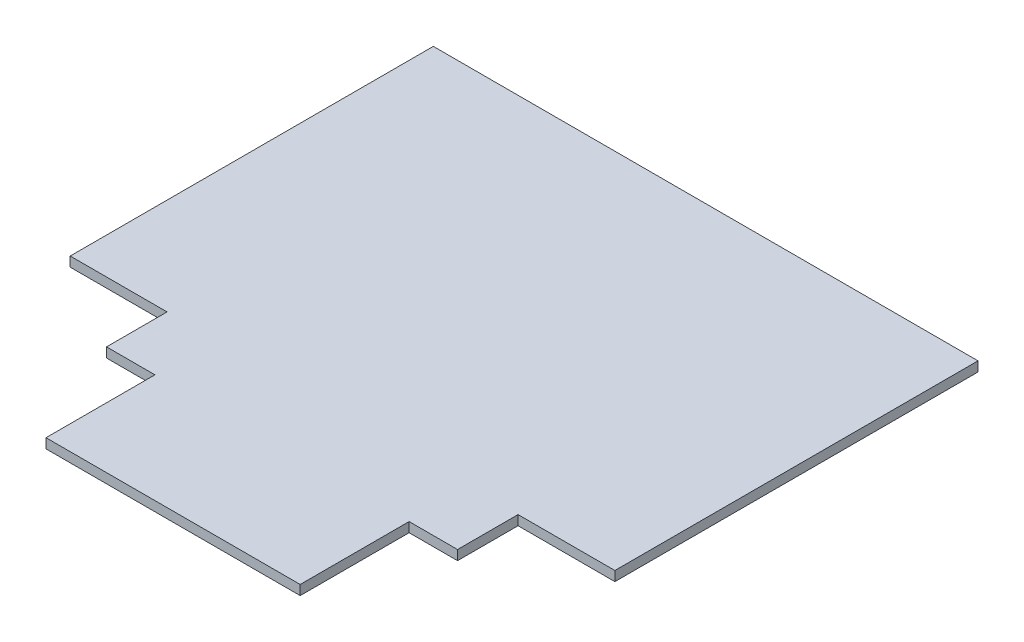
ISO-10303-21;
HEADER;
FILE_DESCRIPTION(('STEP AP214'),'2;1');
FILE_NAME('part.step','',(''),(''),'','','');
FILE_SCHEMA(('AUTOMOTIVE_DESIGN { 1 0 10303 214 1 1 1 1 }'));
ENDSEC;
DATA;
#1=APPLICATION_CONTEXT('core data for automotive mechanical design processes');
#2=APPLICATION_PROTOCOL_DEFINITION('international standard','automotive_design',2000,#1);
#3=PRODUCT_CONTEXT('',#1,'mechanical');
#4=PRODUCT('Part','Part','',(#3));
#5=PRODUCT_RELATED_PRODUCT_CATEGORY('part','',(#4));
#6=PRODUCT_DEFINITION_FORMATION('','',#4);
#7=PRODUCT_DEFINITION_CONTEXT('part definition',#1,'design');
#8=PRODUCT_DEFINITION('design','',#6,#7);
#9=PRODUCT_DEFINITION_SHAPE('','',#8);
#10=(LENGTH_UNIT() NAMED_UNIT(*) SI_UNIT(.MILLI.,.METRE.));
#11=(NAMED_UNIT(*) PLANE_ANGLE_UNIT() SI_UNIT($,.RADIAN.));
#12=(NAMED_UNIT(*) SI_UNIT($,.STERADIAN.) SOLID_ANGLE_UNIT());
#13=UNCERTAINTY_MEASURE_WITH_UNIT(LENGTH_MEASURE(1.E-05),#10,'distance_accuracy_value','');
#14=(GEOMETRIC_REPRESENTATION_CONTEXT(3) GLOBAL_UNCERTAINTY_ASSIGNED_CONTEXT((#13)) GLOBAL_UNIT_ASSIGNED_CONTEXT((#10,
#11,#12)) REPRESENTATION_CONTEXT('',''));
#15=CARTESIAN_POINT('',(0.,0.,0.));
#16=DIRECTION('',(0.,0.,1.));
#17=DIRECTION('',(1.,0.,0.));
#18=AXIS2_PLACEMENT_3D('',#15,#16,#17);
#19=CARTESIAN_POINT('',(165.,4.,0.));
#20=DIRECTION('',(1.,0.,0.));
#21=DIRECTION('',(0.,0.,-1.));
#22=AXIS2_PLACEMENT_3D('',#19,#20,#21);
#23=PLANE('',#22);
#24=DIRECTION('',(0.,0.,1.));
#25=VECTOR('',#24,1.);
#26=CARTESIAN_POINT('',(165.,0.,0.));
#27=LINE('',#26,#25);
#28=CARTESIAN_POINT('',(165.,0.,-45.));
#29=VERTEX_POINT('',#28);
#30=CARTESIAN_POINT('',(165.,0.,0.));
#31=VERTEX_POINT('',#30);
#32=EDGE_CURVE('E167',#29,#31,#27,.T.);
#33=ORIENTED_EDGE('',*,*,#32,.F.);
#34=DIRECTION('',(0.,-1.,0.));
#35=VECTOR('',#34,1.);
#36=CARTESIAN_POINT('',(165.,4.,-45.));
#37=LINE('',#36,#35);
#38=CARTESIAN_POINT('',(165.,4.,-45.));
#39=VERTEX_POINT('',#38);
#40=EDGE_CURVE('E11',#39,#29,#37,.T.);
#41=ORIENTED_EDGE('',*,*,#40,.F.);
#42=DIRECTION('',(0.,0.,1.));
#43=VECTOR('',#42,1.);
#44=CARTESIAN_POINT('',(165.,4.,0.));
#45=LINE('',#44,#43);
#46=CARTESIAN_POINT('',(165.,4.,0.));
#47=VERTEX_POINT('',#46);
#48=EDGE_CURVE('E210',#39,#47,#45,.T.);
#49=ORIENTED_EDGE('',*,*,#48,.T.);
#50=DIRECTION('',(0.,-1.,0.));
#51=VECTOR('',#50,1.);
#52=CARTESIAN_POINT('',(165.,4.,0.));
#53=LINE('',#52,#51);
#54=EDGE_CURVE('E111',#47,#31,#53,.T.);
#55=ORIENTED_EDGE('',*,*,#54,.T.);
#56=EDGE_LOOP('',(#33,#41,#49,#55));
#57=FACE_BOUND('',#56,.T.);
#58=ADVANCED_FACE('F47',(#57),#23,.T.);
#59=CARTESIAN_POINT('',(0.,4.,-45.0000000000001));
#60=DIRECTION('',(0.,0.,1.));
#61=DIRECTION('',(1.,0.,0.));
#62=AXIS2_PLACEMENT_3D('',#59,#60,#61);
#63=PLANE('',#62);
#64=DIRECTION('',(-1.,0.,0.));
#65=VECTOR('',#64,1.);
#66=CARTESIAN_POINT('',(0.,0.,-45.0000000000001));
#67=LINE('',#66,#65);
#68=CARTESIAN_POINT('',(185.,0.,-45.));
#69=VERTEX_POINT('',#68);
#70=EDGE_CURVE('E171',#69,#29,#67,.T.);
#71=ORIENTED_EDGE('',*,*,#70,.F.);
#72=DIRECTION('',(0.,-1.,0.));
#73=VECTOR('',#72,1.);
#74=CARTESIAN_POINT('',(185.,4.,-45.));
#75=LINE('',#74,#73);
#76=CARTESIAN_POINT('',(185.,4.,-45.));
#77=VERTEX_POINT('',#76);
#78=EDGE_CURVE('E56',#77,#69,#75,.T.);
#79=ORIENTED_EDGE('',*,*,#78,.F.);
#80=DIRECTION('',(-1.,0.,0.));
#81=VECTOR('',#80,1.);
#82=CARTESIAN_POINT('',(0.,4.,-45.0000000000001));
#83=LINE('',#82,#81);
#84=EDGE_CURVE('E250',#77,#39,#83,.T.);
#85=ORIENTED_EDGE('',*,*,#84,.T.);
#86=ORIENTED_EDGE('',*,*,#40,.T.);
#87=EDGE_LOOP('',(#71,#79,#85,#86));
#88=FACE_BOUND('',#87,.T.);
#89=ADVANCED_FACE('F249',(#88),#63,.T.);
#90=CARTESIAN_POINT('',(185.,4.,0.));
#91=DIRECTION('',(-1.,0.,0.));
#92=DIRECTION('',(0.,0.,1.));
#93=AXIS2_PLACEMENT_3D('',#90,#91,#92);
#94=PLANE('',#93);
#95=DIRECTION('',(0.,0.,-1.));
#96=VECTOR('',#95,1.);
#97=CARTESIAN_POINT('',(185.,0.,0.));
#98=LINE('',#97,#96);
#99=CARTESIAN_POINT('',(185.,0.,-70.));
#100=VERTEX_POINT('',#99);
#101=EDGE_CURVE('E175',#69,#100,#98,.T.);
#102=ORIENTED_EDGE('',*,*,#101,.T.);
#103=DIRECTION('',(0.,-1.,0.));
#104=VECTOR('',#103,1.);
#105=CARTESIAN_POINT('',(185.,4.,-70.));
#106=LINE('',#105,#104);
#107=CARTESIAN_POINT('',(185.,4.,-70.));
#108=VERTEX_POINT('',#107);
#109=EDGE_CURVE('E232',#108,#100,#106,.T.);
#110=ORIENTED_EDGE('',*,*,#109,.F.);
#111=DIRECTION('',(0.,0.,-1.));
#112=VECTOR('',#111,1.);
#113=CARTESIAN_POINT('',(185.,4.,0.));
#114=LINE('',#113,#112);
#115=EDGE_CURVE('E240',#77,#108,#114,.T.);
#116=ORIENTED_EDGE('',*,*,#115,.F.);
#117=ORIENTED_EDGE('',*,*,#78,.T.);
#118=EDGE_LOOP('',(#102,#110,#116,#117));
#119=FACE_BOUND('',#118,.T.);
#120=ADVANCED_FACE('F238',(#119),#94,.F.);
#121=CARTESIAN_POINT('',(0.,4.,-70.0000000000002));
#122=DIRECTION('',(0.,0.,1.));
#123=DIRECTION('',(1.,0.,0.));
#124=AXIS2_PLACEMENT_3D('',#121,#122,#123);
#125=PLANE('',#124);
#126=DIRECTION('',(-1.,0.,0.));
#127=VECTOR('',#126,1.);
#128=CARTESIAN_POINT('',(0.,0.,-70.0000000000002));
#129=LINE('',#128,#127);
#130=CARTESIAN_POINT('',(225.,0.,-70.));
#131=VERTEX_POINT('',#130);
#132=EDGE_CURVE('E179',#131,#100,#129,.T.);
#133=ORIENTED_EDGE('',*,*,#132,.F.);
#134=DIRECTION('',(0.,-1.,0.));
#135=VECTOR('',#134,1.);
#136=CARTESIAN_POINT('',(225.,4.,-70.));
#137=LINE('',#136,#135);
#138=CARTESIAN_POINT('',(225.,4.,-70.));
#139=VERTEX_POINT('',#138);
#140=EDGE_CURVE('E229',#139,#131,#137,.T.);
#141=ORIENTED_EDGE('',*,*,#140,.F.);
#142=DIRECTION('',(-1.,0.,0.));
#143=VECTOR('',#142,1.);
#144=CARTESIAN_POINT('',(0.,4.,-70.0000000000002));
#145=LINE('',#144,#143);
#146=EDGE_CURVE('E261',#139,#108,#145,.T.);
#147=ORIENTED_EDGE('',*,*,#146,.T.);
#148=ORIENTED_EDGE('',*,*,#109,.T.);
#149=EDGE_LOOP('',(#133,#141,#147,#148));
#150=FACE_BOUND('',#149,.T.);
#151=ADVANCED_FACE('F297',(#150),#125,.T.);
#152=CARTESIAN_POINT('',(225.,4.,0.));
#153=DIRECTION('',(-1.,0.,0.));
#154=DIRECTION('',(0.,0.,1.));
#155=AXIS2_PLACEMENT_3D('',#152,#153,#154);
#156=PLANE('',#155);
#157=DIRECTION('',(0.,0.,-1.));
#158=VECTOR('',#157,1.);
#159=CARTESIAN_POINT('',(225.,0.,0.));
#160=LINE('',#159,#158);
#161=CARTESIAN_POINT('',(225.,0.,-220.));
#162=VERTEX_POINT('',#161);
#163=EDGE_CURVE('E183',#131,#162,#160,.T.);
#164=ORIENTED_EDGE('',*,*,#163,.T.);
#165=DIRECTION('',(0.,-1.,0.));
#166=VECTOR('',#165,1.);
#167=CARTESIAN_POINT('',(225.,4.,-220.));
#168=LINE('',#167,#166);
#169=CARTESIAN_POINT('',(225.,4.,-220.));
#170=VERTEX_POINT('',#169);
#171=EDGE_CURVE('E226',#170,#162,#168,.T.);
#172=ORIENTED_EDGE('',*,*,#171,.F.);
#173=DIRECTION('',(0.,0.,-1.));
#174=VECTOR('',#173,1.);
#175=CARTESIAN_POINT('',(225.,4.,0.));
#176=LINE('',#175,#174);
#177=EDGE_CURVE('E265',#139,#170,#176,.T.);
#178=ORIENTED_EDGE('',*,*,#177,.F.);
#179=ORIENTED_EDGE('',*,*,#140,.T.);
#180=EDGE_LOOP('',(#164,#172,#178,#179));
#181=FACE_BOUND('',#180,.T.);
#182=ADVANCED_FACE('F300',(#181),#156,.F.);
#183=CARTESIAN_POINT('',(0.,4.,-220.));
#184=DIRECTION('',(0.,0.,-1.));
#185=DIRECTION('',(-1.,0.,0.));
#186=AXIS2_PLACEMENT_3D('',#183,#184,#185);
#187=PLANE('',#186);
#188=DIRECTION('',(1.,0.,0.));
#189=VECTOR('',#188,1.);
#190=CARTESIAN_POINT('',(0.,0.,-220.));
#191=LINE('',#190,#189);
#192=CARTESIAN_POINT('',(0.,0.,-220.));
#193=VERTEX_POINT('',#192);
#194=EDGE_CURVE('E187',#193,#162,#191,.T.);
#195=ORIENTED_EDGE('',*,*,#194,.F.);
#196=DIRECTION('',(0.,-1.,0.));
#197=VECTOR('',#196,1.);
#198=CARTESIAN_POINT('',(0.,4.,-220.));
#199=LINE('',#198,#197);
#200=CARTESIAN_POINT('',(0.,4.,-220.));
#201=VERTEX_POINT('',#200);
#202=EDGE_CURVE('E223',#201,#193,#199,.T.);
#203=ORIENTED_EDGE('',*,*,#202,.F.);
#204=DIRECTION('',(1.,0.,0.));
#205=VECTOR('',#204,1.);
#206=CARTESIAN_POINT('',(0.,4.,-220.));
#207=LINE('',#206,#205);
#208=EDGE_CURVE('E268',#201,#170,#207,.T.);
#209=ORIENTED_EDGE('',*,*,#208,.T.);
#210=ORIENTED_EDGE('',*,*,#171,.T.);
#211=EDGE_LOOP('',(#195,#203,#209,#210));
#212=FACE_BOUND('',#211,.T.);
#213=ADVANCED_FACE('F293',(#212),#187,.T.);
#214=CARTESIAN_POINT('',(0.,4.,0.));
#215=DIRECTION('',(-1.,0.,0.));
#216=DIRECTION('',(0.,0.,1.));
#217=AXIS2_PLACEMENT_3D('',#214,#215,#216);
#218=PLANE('',#217);
#219=DIRECTION('',(0.,0.,-1.));
#220=VECTOR('',#219,1.);
#221=CARTESIAN_POINT('',(0.,0.,0.));
#222=LINE('',#221,#220);
#223=CARTESIAN_POINT('',(0.,0.,-70.));
#224=VERTEX_POINT('',#223);
#225=EDGE_CURVE('E191',#224,#193,#222,.T.);
#226=ORIENTED_EDGE('',*,*,#225,.F.);
#227=DIRECTION('',(0.,-1.,0.));
#228=VECTOR('',#227,1.);
#229=CARTESIAN_POINT('',(0.,4.,-70.));
#230=LINE('',#229,#228);
#231=CARTESIAN_POINT('',(0.,4.,-70.));
#232=VERTEX_POINT('',#231);
#233=EDGE_CURVE('E220',#232,#224,#230,.T.);
#234=ORIENTED_EDGE('',*,*,#233,.F.);
#235=DIRECTION('',(0.,0.,-1.));
#236=VECTOR('',#235,1.);
#237=CARTESIAN_POINT('',(0.,4.,0.));
#238=LINE('',#237,#236);
#239=EDGE_CURVE('E272',#232,#201,#238,.T.);
#240=ORIENTED_EDGE('',*,*,#239,.T.);
#241=ORIENTED_EDGE('',*,*,#202,.T.);
#242=EDGE_LOOP('',(#226,#234,#240,#241));
#243=FACE_BOUND('',#242,.T.);
#244=ADVANCED_FACE('F287',(#243),#218,.T.);
#245=CARTESIAN_POINT('',(0.,4.,-70.));
#246=DIRECTION('',(0.,0.,-1.));
#247=DIRECTION('',(-1.,0.,0.));
#248=AXIS2_PLACEMENT_3D('',#245,#246,#247);
#249=PLANE('',#248);
#250=DIRECTION('',(1.,0.,0.));
#251=VECTOR('',#250,1.);
#252=CARTESIAN_POINT('',(0.,0.,-70.));
#253=LINE('',#252,#251);
#254=CARTESIAN_POINT('',(40.,0.,-70.));
#255=VERTEX_POINT('',#254);
#256=EDGE_CURVE('E195',#224,#255,#253,.T.);
#257=ORIENTED_EDGE('',*,*,#256,.T.);
#258=DIRECTION('',(0.,-1.,0.));
#259=VECTOR('',#258,1.);
#260=CARTESIAN_POINT('',(40.,4.,-70.));
#261=LINE('',#260,#259);
#262=CARTESIAN_POINT('',(40.,4.,-70.));
#263=VERTEX_POINT('',#262);
#264=EDGE_CURVE('E217',#263,#255,#261,.T.);
#265=ORIENTED_EDGE('',*,*,#264,.F.);
#266=DIRECTION('',(1.,0.,0.));
#267=VECTOR('',#266,1.);
#268=CARTESIAN_POINT('',(0.,4.,-70.));
#269=LINE('',#268,#267);
#270=EDGE_CURVE('E276',#232,#263,#269,.T.);
#271=ORIENTED_EDGE('',*,*,#270,.F.);
#272=ORIENTED_EDGE('',*,*,#233,.T.);
#273=EDGE_LOOP('',(#257,#265,#271,#272));
#274=FACE_BOUND('',#273,.T.);
#275=ADVANCED_FACE('F344',(#274),#249,.F.);
#276=CARTESIAN_POINT('',(40.,4.,0.));
#277=DIRECTION('',(-1.,0.,0.));
#278=DIRECTION('',(0.,0.,1.));
#279=AXIS2_PLACEMENT_3D('',#276,#277,#278);
#280=PLANE('',#279);
#281=DIRECTION('',(0.,0.,-1.));
#282=VECTOR('',#281,1.);
#283=CARTESIAN_POINT('',(40.,0.,0.));
#284=LINE('',#283,#282);
#285=CARTESIAN_POINT('',(40.,0.,-45.));
#286=VERTEX_POINT('',#285);
#287=EDGE_CURVE('E199',#286,#255,#284,.T.);
#288=ORIENTED_EDGE('',*,*,#287,.F.);
#289=DIRECTION('',(0.,-1.,0.));
#290=VECTOR('',#289,1.);
#291=CARTESIAN_POINT('',(40.,4.,-45.));
#292=LINE('',#291,#290);
#293=CARTESIAN_POINT('',(40.,4.,-45.));
#294=VERTEX_POINT('',#293);
#295=EDGE_CURVE('E157',#294,#286,#292,.T.);
#296=ORIENTED_EDGE('',*,*,#295,.F.);
#297=DIRECTION('',(0.,0.,-1.));
#298=VECTOR('',#297,1.);
#299=CARTESIAN_POINT('',(40.,4.,0.));
#300=LINE('',#299,#298);
#301=EDGE_CURVE('E148',#294,#263,#300,.T.);
#302=ORIENTED_EDGE('',*,*,#301,.T.);
#303=ORIENTED_EDGE('',*,*,#264,.T.);
#304=EDGE_LOOP('',(#288,#296,#302,#303));
#305=FACE_BOUND('',#304,.T.);
#306=ADVANCED_FACE('F281',(#305),#280,.T.);
#307=CARTESIAN_POINT('',(0.,4.,-45.));
#308=DIRECTION('',(0.,0.,-1.));
#309=DIRECTION('',(-1.,0.,0.));
#310=AXIS2_PLACEMENT_3D('',#307,#308,#309);
#311=PLANE('',#310);
#312=DIRECTION('',(1.,0.,0.));
#313=VECTOR('',#312,1.);
#314=CARTESIAN_POINT('',(0.,0.,-45.));
#315=LINE('',#314,#313);
#316=CARTESIAN_POINT('',(60.,0.,-45.));
#317=VERTEX_POINT('',#316);
#318=EDGE_CURVE('E155',#286,#317,#315,.T.);
#319=ORIENTED_EDGE('',*,*,#318,.T.);
#320=DIRECTION('',(0.,-1.,0.));
#321=VECTOR('',#320,1.);
#322=CARTESIAN_POINT('',(60.,4.,-45.));
#323=LINE('',#322,#321);
#324=CARTESIAN_POINT('',(60.,4.,-45.));
#325=VERTEX_POINT('',#324);
#326=EDGE_CURVE('E152',#325,#317,#323,.T.);
#327=ORIENTED_EDGE('',*,*,#326,.F.);
#328=DIRECTION('',(1.,0.,0.));
#329=VECTOR('',#328,1.);
#330=CARTESIAN_POINT('',(0.,4.,-45.));
#331=LINE('',#330,#329);
#332=EDGE_CURVE('E142',#294,#325,#331,.T.);
#333=ORIENTED_EDGE('',*,*,#332,.F.);
#334=ORIENTED_EDGE('',*,*,#295,.T.);
#335=EDGE_LOOP('',(#319,#327,#333,#334));
#336=FACE_BOUND('',#335,.T.);
#337=ADVANCED_FACE('F153',(#336),#311,.F.);
#338=CARTESIAN_POINT('',(60.,4.,0.));
#339=DIRECTION('',(1.,0.,0.));
#340=DIRECTION('',(0.,0.,-1.));
#341=AXIS2_PLACEMENT_3D('',#338,#339,#340);
#342=PLANE('',#341);
#343=DIRECTION('',(0.,0.,1.));
#344=VECTOR('',#343,1.);
#345=CARTESIAN_POINT('',(60.,0.,0.));
#346=LINE('',#345,#344);
#347=CARTESIAN_POINT('',(60.,0.,0.));
#348=VERTEX_POINT('',#347);
#349=EDGE_CURVE('E104',#317,#348,#346,.T.);
#350=ORIENTED_EDGE('',*,*,#349,.T.);
#351=DIRECTION('',(0.,-1.,0.));
#352=VECTOR('',#351,1.);
#353=CARTESIAN_POINT('',(60.,4.,0.));
#354=LINE('',#353,#352);
#355=CARTESIAN_POINT('',(60.,4.,0.));
#356=VERTEX_POINT('',#355);
#357=EDGE_CURVE('E158',#356,#348,#354,.T.);
#358=ORIENTED_EDGE('',*,*,#357,.F.);
#359=DIRECTION('',(0.,0.,1.));
#360=VECTOR('',#359,1.);
#361=CARTESIAN_POINT('',(60.,4.,0.));
#362=LINE('',#361,#360);
#363=EDGE_CURVE('E146',#325,#356,#362,.T.);
#364=ORIENTED_EDGE('',*,*,#363,.F.);
#365=ORIENTED_EDGE('',*,*,#326,.T.);
#366=EDGE_LOOP('',(#350,#358,#364,#365));
#367=FACE_BOUND('',#366,.T.);
#368=ADVANCED_FACE('F160',(#367),#342,.F.);
#369=CARTESIAN_POINT('',(0.,4.,0.));
#370=DIRECTION('',(0.,0.,-1.));
#371=DIRECTION('',(-1.,0.,0.));
#372=AXIS2_PLACEMENT_3D('',#369,#370,#371);
#373=PLANE('',#372);
#374=DIRECTION('',(1.,0.,0.));
#375=VECTOR('',#374,1.);
#376=CARTESIAN_POINT('',(0.,0.,0.));
#377=LINE('',#376,#375);
#378=EDGE_CURVE('E207',#348,#31,#377,.T.);
#379=ORIENTED_EDGE('',*,*,#378,.T.);
#380=ORIENTED_EDGE('',*,*,#54,.F.);
#381=DIRECTION('',(1.,0.,0.));
#382=VECTOR('',#381,1.);
#383=CARTESIAN_POINT('',(0.,4.,0.));
#384=LINE('',#383,#382);
#385=EDGE_CURVE('E64',#356,#47,#384,.T.);
#386=ORIENTED_EDGE('',*,*,#385,.F.);
#387=ORIENTED_EDGE('',*,*,#357,.T.);
#388=EDGE_LOOP('',(#379,#380,#386,#387));
#389=FACE_BOUND('',#388,.T.);
#390=ADVANCED_FACE('F253',(#389),#373,.F.);
#391=CARTESIAN_POINT('',(0.,4.,0.));
#392=DIRECTION('',(0.,1.,0.));
#393=DIRECTION('',(0.,0.,1.));
#394=AXIS2_PLACEMENT_3D('',#391,#392,#393);
#395=PLANE('',#394);
#396=ORIENTED_EDGE('',*,*,#48,.F.);
#397=ORIENTED_EDGE('',*,*,#84,.F.);
#398=ORIENTED_EDGE('',*,*,#115,.T.);
#399=ORIENTED_EDGE('',*,*,#146,.F.);
#400=ORIENTED_EDGE('',*,*,#177,.T.);
#401=ORIENTED_EDGE('',*,*,#208,.F.);
#402=ORIENTED_EDGE('',*,*,#239,.F.);
#403=ORIENTED_EDGE('',*,*,#270,.T.);
#404=ORIENTED_EDGE('',*,*,#301,.F.);
#405=ORIENTED_EDGE('',*,*,#332,.T.);
#406=ORIENTED_EDGE('',*,*,#363,.T.);
#407=ORIENTED_EDGE('',*,*,#385,.T.);
#408=EDGE_LOOP('',(#396,#397,#398,#399,#400,#401,#402,#403,#404,#405,#406,#407));
#409=FACE_BOUND('',#408,.T.);
#410=ADVANCED_FACE('F144',(#409),#395,.T.);
#411=CARTESIAN_POINT('',(0.,0.,0.));
#412=DIRECTION('',(0.,1.,0.));
#413=DIRECTION('',(0.,0.,1.));
#414=AXIS2_PLACEMENT_3D('',#411,#412,#413);
#415=PLANE('',#414);
#416=ORIENTED_EDGE('',*,*,#32,.T.);
#417=ORIENTED_EDGE('',*,*,#378,.F.);
#418=ORIENTED_EDGE('',*,*,#349,.F.);
#419=ORIENTED_EDGE('',*,*,#318,.F.);
#420=ORIENTED_EDGE('',*,*,#287,.T.);
#421=ORIENTED_EDGE('',*,*,#256,.F.);
#422=ORIENTED_EDGE('',*,*,#225,.T.);
#423=ORIENTED_EDGE('',*,*,#194,.T.);
#424=ORIENTED_EDGE('',*,*,#163,.F.);
#425=ORIENTED_EDGE('',*,*,#132,.T.);
#426=ORIENTED_EDGE('',*,*,#101,.F.);
#427=ORIENTED_EDGE('',*,*,#70,.T.);
#428=EDGE_LOOP('',(#416,#417,#418,#419,#420,#421,#422,#423,#424,#425,#426,#427));
#429=FACE_BOUND('',#428,.T.);
#430=ADVANCED_FACE('F246',(#429),#415,.F.);
#431=CLOSED_SHELL('',(#58,#89,#120,#151,#182,#213,#244,#275,#306,#337,#368,#390,#410,#430));
#432=MANIFOLD_SOLID_BREP('B2',#431);
#433=ADVANCED_BREP_SHAPE_REPRESENTATION('',(#18,#432),#14);
#434=SHAPE_DEFINITION_REPRESENTATION(#9,#433);
ENDSEC;
END-ISO-10303-21;
